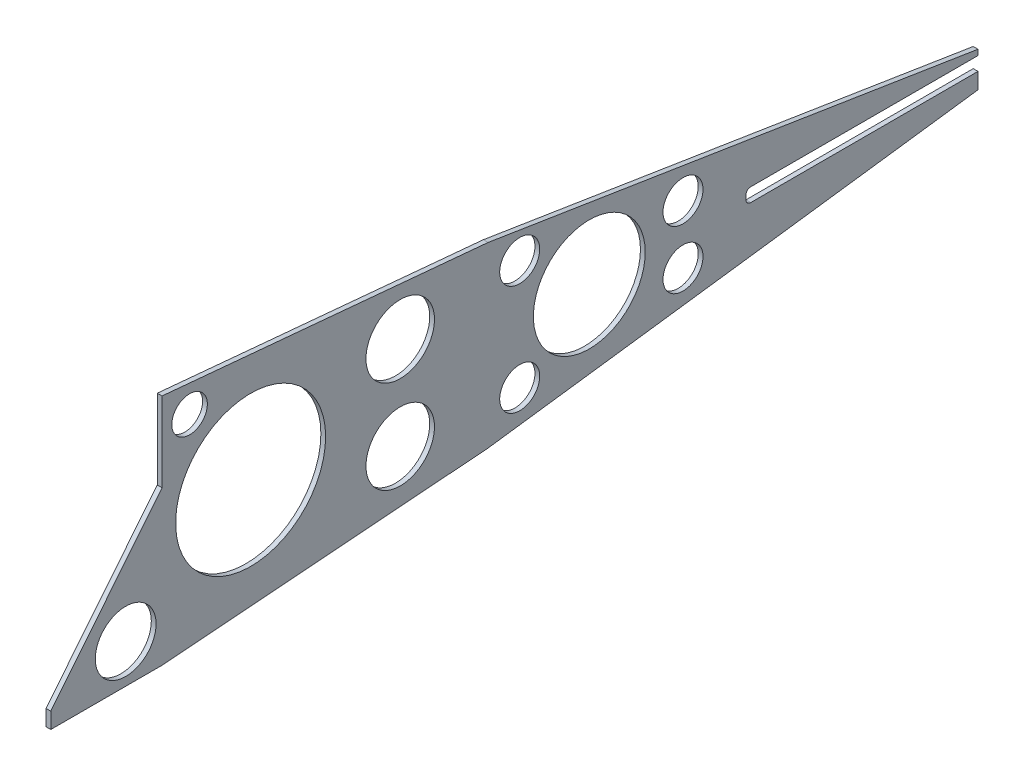
ISO-10303-21;
HEADER;
FILE_DESCRIPTION(('STEP AP214'),'2;1');
FILE_NAME('part.step','',(''),(''),'','','');
FILE_SCHEMA(('AUTOMOTIVE_DESIGN { 1 0 10303 214 1 1 1 1 }'));
ENDSEC;
DATA;
#1=APPLICATION_CONTEXT('core data for automotive mechanical design processes');
#2=APPLICATION_PROTOCOL_DEFINITION('international standard','automotive_design',2000,#1);
#3=PRODUCT_CONTEXT('',#1,'mechanical');
#4=PRODUCT('Part','Part','',(#3));
#5=PRODUCT_RELATED_PRODUCT_CATEGORY('part','',(#4));
#6=PRODUCT_DEFINITION_FORMATION('','',#4);
#7=PRODUCT_DEFINITION_CONTEXT('part definition',#1,'design');
#8=PRODUCT_DEFINITION('design','',#6,#7);
#9=PRODUCT_DEFINITION_SHAPE('','',#8);
#10=(LENGTH_UNIT() NAMED_UNIT(*) SI_UNIT(.MILLI.,.METRE.));
#11=(NAMED_UNIT(*) PLANE_ANGLE_UNIT() SI_UNIT($,.RADIAN.));
#12=(NAMED_UNIT(*) SI_UNIT($,.STERADIAN.) SOLID_ANGLE_UNIT());
#13=UNCERTAINTY_MEASURE_WITH_UNIT(LENGTH_MEASURE(1.E-05),#10,'distance_accuracy_value','');
#14=(GEOMETRIC_REPRESENTATION_CONTEXT(3) GLOBAL_UNCERTAINTY_ASSIGNED_CONTEXT((#13)) GLOBAL_UNIT_ASSIGNED_CONTEXT((#10,
#11,#12)) REPRESENTATION_CONTEXT('',''));
#15=CARTESIAN_POINT('',(0.,0.,0.));
#16=DIRECTION('',(0.,0.,1.));
#17=DIRECTION('',(1.,0.,0.));
#18=AXIS2_PLACEMENT_3D('',#15,#16,#17);
#19=CARTESIAN_POINT('',(-1.5,-0.530689138309698,-513.4));
#20=DIRECTION('',(0.,0.,-1.));
#21=DIRECTION('',(-1.,0.,0.));
#22=AXIS2_PLACEMENT_3D('',#19,#20,#21);
#23=PLANE('',#22);
#24=DIRECTION('',(-1.,0.,0.));
#25=VECTOR('',#24,1.);
#26=CARTESIAN_POINT('',(-1.5,-12.5999999999999,-513.4));
#27=LINE('',#26,#25);
#28=CARTESIAN_POINT('',(1.5,-12.5999999999999,-513.4));
#29=VERTEX_POINT('',#28);
#30=CARTESIAN_POINT('',(-1.5,-12.5999999999999,-513.4));
#31=VERTEX_POINT('',#30);
#32=EDGE_CURVE('E164',#29,#31,#27,.T.);
#33=ORIENTED_EDGE('',*,*,#32,.F.);
#34=DIRECTION('',(0.,1.,0.));
#35=VECTOR('',#34,1.);
#36=CARTESIAN_POINT('',(1.5,-0.530689138309698,-513.4));
#37=LINE('',#36,#35);
#38=CARTESIAN_POINT('',(1.5,-22.6501543513627,-513.4));
#39=VERTEX_POINT('',#38);
#40=EDGE_CURVE('E257',#39,#29,#37,.T.);
#41=ORIENTED_EDGE('',*,*,#40,.F.);
#42=DIRECTION('',(1.,0.,0.));
#43=VECTOR('',#42,1.);
#44=CARTESIAN_POINT('',(-1.5,-22.6501543513627,-513.4));
#45=LINE('',#44,#43);
#46=CARTESIAN_POINT('',(-1.5,-22.6501543513627,-513.4));
#47=VERTEX_POINT('',#46);
#48=EDGE_CURVE('E198',#47,#39,#45,.T.);
#49=ORIENTED_EDGE('',*,*,#48,.F.);
#50=DIRECTION('',(0.,1.,0.));
#51=VECTOR('',#50,1.);
#52=CARTESIAN_POINT('',(-1.5,-0.530689138309698,-513.4));
#53=LINE('',#52,#51);
#54=EDGE_CURVE('E172',#47,#31,#53,.T.);
#55=ORIENTED_EDGE('',*,*,#54,.T.);
#56=EDGE_LOOP('',(#33,#41,#49,#55));
#57=FACE_BOUND('',#56,.T.);
#58=ADVANCED_FACE('F39',(#57),#23,.T.);
#59=CARTESIAN_POINT('',(-1.5,17.2248503298606,0.));
#60=DIRECTION('',(0.,0.627918395010104,0.778279184616892));
#61=DIRECTION('',(0.,-0.778279184616892,0.627918395010104));
#62=AXIS2_PLACEMENT_3D('',#59,#60,#61);
#63=PLANE('',#62);
#64=DIRECTION('',(1.,0.,0.));
#65=VECTOR('',#64,1.);
#66=CARTESIAN_POINT('',(-1.5,-69.5372884386745,70.));
#67=LINE('',#66,#65);
#68=CARTESIAN_POINT('',(-1.5,-69.5372884386745,70.));
#69=VERTEX_POINT('',#68);
#70=CARTESIAN_POINT('',(1.5,-69.5372884386745,70.));
#71=VERTEX_POINT('',#70);
#72=EDGE_CURVE('E188',#69,#71,#67,.T.);
#73=ORIENTED_EDGE('',*,*,#72,.T.);
#74=DIRECTION('',(0.,-0.778279184616892,0.627918395010104));
#75=VECTOR('',#74,1.);
#76=CARTESIAN_POINT('',(1.5,17.2248503298606,0.));
#77=LINE('',#76,#75);
#78=CARTESIAN_POINT('',(1.5,17.2248503298606,0.));
#79=VERTEX_POINT('',#78);
#80=EDGE_CURVE('E242',#79,#71,#77,.T.);
#81=ORIENTED_EDGE('',*,*,#80,.F.);
#82=DIRECTION('',(1.,0.,0.));
#83=VECTOR('',#82,1.);
#84=CARTESIAN_POINT('',(-1.5,17.2248503298606,0.));
#85=LINE('',#84,#83);
#86=CARTESIAN_POINT('',(-1.5,17.2248503298606,0.));
#87=VERTEX_POINT('',#86);
#88=EDGE_CURVE('E189',#87,#79,#85,.T.);
#89=ORIENTED_EDGE('',*,*,#88,.F.);
#90=DIRECTION('',(0.,-0.778279184616892,0.627918395010104));
#91=VECTOR('',#90,1.);
#92=CARTESIAN_POINT('',(-1.5,17.2248503298606,0.));
#93=LINE('',#92,#91);
#94=EDGE_CURVE('E268',#87,#69,#93,.T.);
#95=ORIENTED_EDGE('',*,*,#94,.T.);
#96=EDGE_LOOP('',(#73,#81,#89,#95));
#97=FACE_BOUND('',#96,.T.);
#98=ADVANCED_FACE('F293',(#97),#63,.T.);
#99=CARTESIAN_POINT('',(-1.5,67.2248503298606,0.));
#100=DIRECTION('',(0.,0.,1.));
#101=DIRECTION('',(0.,-1.,0.));
#102=AXIS2_PLACEMENT_3D('',#99,#100,#101);
#103=PLANE('',#102);
#104=ORIENTED_EDGE('',*,*,#88,.T.);
#105=DIRECTION('',(0.,-1.,0.));
#106=VECTOR('',#105,1.);
#107=CARTESIAN_POINT('',(1.5,67.2248503298606,0.));
#108=LINE('',#107,#106);
#109=CARTESIAN_POINT('',(1.5,67.2248503298606,0.));
#110=VERTEX_POINT('',#109);
#111=EDGE_CURVE('E265',#110,#79,#108,.T.);
#112=ORIENTED_EDGE('',*,*,#111,.F.);
#113=DIRECTION('',(1.,0.,0.));
#114=VECTOR('',#113,1.);
#115=CARTESIAN_POINT('',(-1.5,67.2248503298606,0.));
#116=LINE('',#115,#114);
#117=CARTESIAN_POINT('',(-1.5,67.2248503298606,0.));
#118=VERTEX_POINT('',#117);
#119=EDGE_CURVE('E192',#118,#110,#116,.T.);
#120=ORIENTED_EDGE('',*,*,#119,.F.);
#121=DIRECTION('',(0.,-1.,0.));
#122=VECTOR('',#121,1.);
#123=CARTESIAN_POINT('',(-1.5,67.2248503298606,0.));
#124=LINE('',#123,#122);
#125=EDGE_CURVE('E185',#118,#87,#124,.T.);
#126=ORIENTED_EDGE('',*,*,#125,.T.);
#127=EDGE_LOOP('',(#104,#112,#120,#126));
#128=FACE_BOUND('',#127,.T.);
#129=ADVANCED_FACE('F297',(#128),#103,.T.);
#130=CARTESIAN_POINT('',(-1.5,67.2248503298606,0.));
#131=DIRECTION('',(0.,0.995767728619681,-0.0919055528224595));
#132=DIRECTION('',(0.,0.0919055528224595,0.995767728619681));
#133=AXIS2_PLACEMENT_3D('',#130,#131,#132);
#134=PLANE('',#133);
#135=ORIENTED_EDGE('',*,*,#119,.T.);
#136=DIRECTION('',(0.,0.0919055528224595,0.995767728619681));
#137=VECTOR('',#136,1.);
#138=CARTESIAN_POINT('',(1.5,67.2248503298606,0.));
#139=LINE('',#138,#137);
#140=CARTESIAN_POINT('',(1.5,48.288859026105,-205.165503831176));
#141=VERTEX_POINT('',#140);
#142=EDGE_CURVE('E262',#141,#110,#139,.T.);
#143=ORIENTED_EDGE('',*,*,#142,.F.);
#144=DIRECTION('',(1.,0.,0.));
#145=VECTOR('',#144,1.);
#146=CARTESIAN_POINT('',(-1.5,48.288859026105,-205.165503831176));
#147=LINE('',#146,#145);
#148=CARTESIAN_POINT('',(-1.5,48.288859026105,-205.165503831176));
#149=VERTEX_POINT('',#148);
#150=EDGE_CURVE('E194',#149,#141,#147,.T.);
#151=ORIENTED_EDGE('',*,*,#150,.F.);
#152=DIRECTION('',(0.,0.0919055528224595,0.995767728619681));
#153=VECTOR('',#152,1.);
#154=CARTESIAN_POINT('',(-1.5,67.2248503298606,0.));
#155=LINE('',#154,#153);
#156=EDGE_CURVE('E182',#149,#118,#155,.T.);
#157=ORIENTED_EDGE('',*,*,#156,.T.);
#158=EDGE_LOOP('',(#135,#143,#151,#157));
#159=FACE_BOUND('',#158,.T.);
#160=ADVANCED_FACE('F300',(#159),#134,.T.);
#161=CARTESIAN_POINT('',(-1.5,48.288859026105,-205.165503831176));
#162=DIRECTION('',(0.,0.987688340595138,-0.156434465040231));
#163=DIRECTION('',(0.,0.156434465040231,0.987688340595138));
#164=AXIS2_PLACEMENT_3D('',#161,#162,#163);
#165=PLANE('',#164);
#166=ORIENTED_EDGE('',*,*,#150,.T.);
#167=DIRECTION('',(0.,0.156434465040231,0.987688340595138));
#168=VECTOR('',#167,1.);
#169=CARTESIAN_POINT('',(1.5,48.288859026105,-205.165503831176));
#170=LINE('',#169,#168);
#171=CARTESIAN_POINT('',(1.5,-0.530689138309698,-513.4));
#172=VERTEX_POINT('',#171);
#173=EDGE_CURVE('E259',#172,#141,#170,.T.);
#174=ORIENTED_EDGE('',*,*,#173,.F.);
#175=DIRECTION('',(1.,0.,0.));
#176=VECTOR('',#175,1.);
#177=CARTESIAN_POINT('',(-1.5,-0.530689138309698,-513.4));
#178=LINE('',#177,#176);
#179=CARTESIAN_POINT('',(-1.5,-0.530689138309698,-513.4));
#180=VERTEX_POINT('',#179);
#181=EDGE_CURVE('E196',#180,#172,#178,.T.);
#182=ORIENTED_EDGE('',*,*,#181,.F.);
#183=DIRECTION('',(0.,0.156434465040231,0.987688340595138));
#184=VECTOR('',#183,1.);
#185=CARTESIAN_POINT('',(-1.5,48.288859026105,-205.165503831176));
#186=LINE('',#185,#184);
#187=EDGE_CURVE('E171',#180,#149,#186,.T.);
#188=ORIENTED_EDGE('',*,*,#187,.T.);
#189=EDGE_LOOP('',(#166,#174,#182,#188));
#190=FACE_BOUND('',#189,.T.);
#191=ADVANCED_FACE('F302',(#190),#165,.T.);
#192=DIRECTION('',(1.,0.,0.));
#193=VECTOR('',#192,1.);
#194=CARTESIAN_POINT('',(-1.5,-3.99999999999994,-513.4));
#195=LINE('',#194,#193);
#196=CARTESIAN_POINT('',(-1.5,-3.99999999999994,-513.4));
#197=VERTEX_POINT('',#196);
#198=CARTESIAN_POINT('',(1.5,-3.99999999999995,-513.4));
#199=VERTEX_POINT('',#198);
#200=EDGE_CURVE('E148',#197,#199,#195,.T.);
#201=ORIENTED_EDGE('',*,*,#200,.F.);
#202=EDGE_CURVE('E161',#197,#180,#53,.T.);
#203=ORIENTED_EDGE('',*,*,#202,.T.);
#204=ORIENTED_EDGE('',*,*,#181,.T.);
#205=EDGE_CURVE('E163',#199,#172,#37,.T.);
#206=ORIENTED_EDGE('',*,*,#205,.F.);
#207=EDGE_LOOP('',(#201,#203,#204,#206));
#208=FACE_BOUND('',#207,.T.);
#209=ADVANCED_FACE('F159',(#208),#23,.T.);
#210=CARTESIAN_POINT('',(-1.5,-22.6501543513627,-513.4));
#211=DIRECTION('',(0.,-0.991235972394931,-0.132103168131108));
#212=DIRECTION('',(0.,0.132103168131108,-0.991235972394931));
#213=AXIS2_PLACEMENT_3D('',#210,#211,#212);
#214=PLANE('',#213);
#215=ORIENTED_EDGE('',*,*,#48,.T.);
#216=DIRECTION('',(0.,0.132103168131108,-0.991235972394931));
#217=VECTOR('',#216,1.);
#218=CARTESIAN_POINT('',(1.5,-22.6501543513627,-513.4));
#219=LINE('',#218,#217);
#220=CARTESIAN_POINT('',(1.5,-63.7176077513932,-205.250409943522));
#221=VERTEX_POINT('',#220);
#222=EDGE_CURVE('E254',#221,#39,#219,.T.);
#223=ORIENTED_EDGE('',*,*,#222,.F.);
#224=DIRECTION('',(1.,0.,0.));
#225=VECTOR('',#224,1.);
#226=CARTESIAN_POINT('',(-1.5,-63.7176077513932,-205.250409943522));
#227=LINE('',#226,#225);
#228=CARTESIAN_POINT('',(-1.5,-63.7176077513932,-205.250409943522));
#229=VERTEX_POINT('',#228);
#230=EDGE_CURVE('E200',#229,#221,#227,.T.);
#231=ORIENTED_EDGE('',*,*,#230,.F.);
#232=DIRECTION('',(0.,0.132103168131108,-0.991235972394931));
#233=VECTOR('',#232,1.);
#234=CARTESIAN_POINT('',(-1.5,-22.6501543513627,-513.4));
#235=LINE('',#234,#233);
#236=EDGE_CURVE('E173',#229,#47,#235,.T.);
#237=ORIENTED_EDGE('',*,*,#236,.T.);
#238=EDGE_LOOP('',(#215,#223,#231,#237));
#239=FACE_BOUND('',#238,.T.);
#240=ADVANCED_FACE('F323',(#239),#214,.T.);
#241=CARTESIAN_POINT('',(-1.5,-63.7176077513932,-205.250409943522));
#242=DIRECTION('',(0.,-0.997042888850237,-0.0768471066024929));
#243=DIRECTION('',(0.,0.0768471066024929,-0.997042888850237));
#244=AXIS2_PLACEMENT_3D('',#241,#242,#243);
#245=PLANE('',#244);
#246=ORIENTED_EDGE('',*,*,#230,.T.);
#247=DIRECTION('',(0.,0.0768471066024929,-0.997042888850237));
#248=VECTOR('',#247,1.);
#249=CARTESIAN_POINT('',(1.5,-63.7176077513932,-205.250409943522));
#250=LINE('',#249,#248);
#251=CARTESIAN_POINT('',(1.5,-79.5372884386745,0.));
#252=VERTEX_POINT('',#251);
#253=EDGE_CURVE('E251',#252,#221,#250,.T.);
#254=ORIENTED_EDGE('',*,*,#253,.F.);
#255=DIRECTION('',(1.,0.,0.));
#256=VECTOR('',#255,1.);
#257=CARTESIAN_POINT('',(-1.5,-79.5372884386745,0.));
#258=LINE('',#257,#256);
#259=CARTESIAN_POINT('',(-1.5,-79.5372884386745,0.));
#260=VERTEX_POINT('',#259);
#261=EDGE_CURVE('E202',#260,#252,#258,.T.);
#262=ORIENTED_EDGE('',*,*,#261,.F.);
#263=DIRECTION('',(0.,0.0768471066024929,-0.997042888850237));
#264=VECTOR('',#263,1.);
#265=CARTESIAN_POINT('',(-1.5,-63.7176077513932,-205.250409943522));
#266=LINE('',#265,#264);
#267=EDGE_CURVE('E177',#260,#229,#266,.T.);
#268=ORIENTED_EDGE('',*,*,#267,.T.);
#269=EDGE_LOOP('',(#246,#254,#262,#268));
#270=FACE_BOUND('',#269,.T.);
#271=ADVANCED_FACE('F279',(#270),#245,.T.);
#272=CARTESIAN_POINT('',(-1.5,-79.5372884386745,70.));
#273=DIRECTION('',(0.,-1.,0.));
#274=DIRECTION('',(0.,0.,-1.));
#275=AXIS2_PLACEMENT_3D('',#272,#273,#274);
#276=PLANE('',#275);
#277=ORIENTED_EDGE('',*,*,#261,.T.);
#278=DIRECTION('',(0.,0.,-1.));
#279=VECTOR('',#278,1.);
#280=CARTESIAN_POINT('',(1.5,-79.5372884386745,70.));
#281=LINE('',#280,#279);
#282=CARTESIAN_POINT('',(1.5,-79.5372884386745,70.));
#283=VERTEX_POINT('',#282);
#284=EDGE_CURVE('E248',#283,#252,#281,.T.);
#285=ORIENTED_EDGE('',*,*,#284,.F.);
#286=DIRECTION('',(1.,0.,0.));
#287=VECTOR('',#286,1.);
#288=CARTESIAN_POINT('',(-1.5,-79.5372884386745,70.));
#289=LINE('',#288,#287);
#290=CARTESIAN_POINT('',(-1.5,-79.5372884386745,70.));
#291=VERTEX_POINT('',#290);
#292=EDGE_CURVE('E204',#291,#283,#289,.T.);
#293=ORIENTED_EDGE('',*,*,#292,.F.);
#294=DIRECTION('',(0.,0.,-1.));
#295=VECTOR('',#294,1.);
#296=CARTESIAN_POINT('',(-1.5,-79.5372884386745,70.));
#297=LINE('',#296,#295);
#298=EDGE_CURVE('E274',#291,#260,#297,.T.);
#299=ORIENTED_EDGE('',*,*,#298,.T.);
#300=EDGE_LOOP('',(#277,#285,#293,#299));
#301=FACE_BOUND('',#300,.T.);
#302=ADVANCED_FACE('F285',(#301),#276,.T.);
#303=CARTESIAN_POINT('',(-1.5,-69.5372884386745,70.));
#304=DIRECTION('',(0.,0.,1.));
#305=DIRECTION('',(1.,0.,0.));
#306=AXIS2_PLACEMENT_3D('',#303,#304,#305);
#307=PLANE('',#306);
#308=ORIENTED_EDGE('',*,*,#292,.T.);
#309=DIRECTION('',(0.,-1.,0.));
#310=VECTOR('',#309,1.);
#311=CARTESIAN_POINT('',(1.5,-69.5372884386745,70.));
#312=LINE('',#311,#310);
#313=EDGE_CURVE('E245',#71,#283,#312,.T.);
#314=ORIENTED_EDGE('',*,*,#313,.F.);
#315=ORIENTED_EDGE('',*,*,#72,.F.);
#316=DIRECTION('',(0.,-1.,0.));
#317=VECTOR('',#316,1.);
#318=CARTESIAN_POINT('',(-1.5,-69.5372884386745,70.));
#319=LINE('',#318,#317);
#320=EDGE_CURVE('E271',#69,#291,#319,.T.);
#321=ORIENTED_EDGE('',*,*,#320,.T.);
#322=EDGE_LOOP('',(#308,#314,#315,#321));
#323=FACE_BOUND('',#322,.T.);
#324=ADVANCED_FACE('F289',(#323),#307,.T.);
#325=CARTESIAN_POINT('',(-1.5,0.,0.));
#326=DIRECTION('',(1.,0.,0.));
#327=DIRECTION('',(0.,0.,-1.));
#328=AXIS2_PLACEMENT_3D('',#325,#326,#327);
#329=PLANE('',#328);
#330=CARTESIAN_POINT('',(-1.5,-55.0693391314664,22.8656003852971));
#331=DIRECTION('',(1.,0.,0.));
#332=DIRECTION('',(0.,0.,-1.));
#333=AXIS2_PLACEMENT_3D('',#330,#331,#332);
#334=CIRCLE('',#333,19.1193877962969);
#335=CARTESIAN_POINT('',(-1.5,-55.0693391314664,3.74621258900012));
#336=VERTEX_POINT('',#335);
#337=EDGE_CURVE('E230',#336,#336,#334,.T.);
#338=ORIENTED_EDGE('',*,*,#337,.T.);
#339=EDGE_LOOP('',(#338));
#340=FACE_BOUND('',#339,.T.);
#341=CARTESIAN_POINT('',(-1.5,9.70145914409179,-327.790100623759));
#342=DIRECTION('',(1.,0.,0.));
#343=DIRECTION('',(0.,0.,-1.));
#344=AXIS2_PLACEMENT_3D('',#341,#342,#343);
#345=CIRCLE('',#344,12.5869787378772);
#346=CARTESIAN_POINT('',(-1.5,9.70145914409179,-340.377079361636));
#347=VERTEX_POINT('',#346);
#348=EDGE_CURVE('E392',#347,#347,#345,.T.);
#349=ORIENTED_EDGE('',*,*,#348,.T.);
#350=EDGE_LOOP('',(#349));
#351=FACE_BOUND('',#350,.T.);
#352=CARTESIAN_POINT('',(-1.5,-35.1806808461792,-149.867646424436));
#353=DIRECTION('',(1.,0.,0.));
#354=DIRECTION('',(0.,0.,-1.));
#355=AXIS2_PLACEMENT_3D('',#352,#353,#354);
#356=CIRCLE('',#355,21.5573807133977);
#357=CARTESIAN_POINT('',(-1.5,-35.1806808461792,-171.425027137834));
#358=VERTEX_POINT('',#357);
#359=EDGE_CURVE('E395',#358,#358,#356,.T.);
#360=ORIENTED_EDGE('',*,*,#359,.T.);
#361=EDGE_LOOP('',(#360));
#362=FACE_BOUND('',#361,.T.);
#363=CARTESIAN_POINT('',(-1.5,23.2938907164738,-149.867646424436));
#364=DIRECTION('',(1.,0.,0.));
#365=DIRECTION('',(0.,0.,-1.));
#366=AXIS2_PLACEMENT_3D('',#363,#364,#365);
#367=CIRCLE('',#366,21.5573807133977);
#368=CARTESIAN_POINT('',(-1.5,23.2938907164738,-171.425027137834));
#369=VERTEX_POINT('',#368);
#370=EDGE_CURVE('E400',#369,#369,#367,.T.);
#371=ORIENTED_EDGE('',*,*,#370,.T.);
#372=EDGE_LOOP('',(#371));
#373=FACE_BOUND('',#372,.T.);
#374=CARTESIAN_POINT('',(-1.5,-6.37956663466746,-268.826339434975));
#375=DIRECTION('',(1.,0.,0.));
#376=DIRECTION('',(0.,0.,-1.));
#377=AXIS2_PLACEMENT_3D('',#374,#375,#376);
#378=CIRCLE('',#377,35.1869918395497);
#379=CARTESIAN_POINT('',(-1.5,-6.37956663466746,-304.013331274525));
#380=VERTEX_POINT('',#379);
#381=EDGE_CURVE('E403',#380,#380,#378,.T.);
#382=ORIENTED_EDGE('',*,*,#381,.T.);
#383=EDGE_LOOP('',(#382));
#384=FACE_BOUND('',#383,.T.);
#385=CARTESIAN_POINT('',(-1.5,-6.37956663466746,-55.7527478664149));
#386=DIRECTION('',(1.,0.,0.));
#387=DIRECTION('',(0.,0.,-1.));
#388=AXIS2_PLACEMENT_3D('',#385,#386,#387);
#389=CIRCLE('',#388,47.1913934733686);
#390=CARTESIAN_POINT('',(-1.5,-6.37956663466746,-102.944141339784));
#391=VERTEX_POINT('',#390);
#392=EDGE_CURVE('E406',#391,#391,#389,.T.);
#393=ORIENTED_EDGE('',*,*,#392,.T.);
#394=EDGE_LOOP('',(#393));
#395=FACE_BOUND('',#394,.T.);
#396=CARTESIAN_POINT('',(-1.5,28.4626558859776,-225.050213703908));
#397=DIRECTION('',(1.,0.,0.));
#398=DIRECTION('',(0.,0.,-1.));
#399=AXIS2_PLACEMENT_3D('',#396,#397,#398);
#400=CIRCLE('',#399,12.5869787378772);
#401=CARTESIAN_POINT('',(-1.5,28.4626558859776,-237.637192441785));
#402=VERTEX_POINT('',#401);
#403=EDGE_CURVE('E409',#402,#402,#400,.T.);
#404=ORIENTED_EDGE('',*,*,#403,.T.);
#405=EDGE_LOOP('',(#404));
#406=FACE_BOUND('',#405,.T.);
#407=CARTESIAN_POINT('',(-1.5,48.5639381094267,-17.3369640616011));
#408=DIRECTION('',(1.,0.,0.));
#409=DIRECTION('',(0.,0.,-1.));
#410=AXIS2_PLACEMENT_3D('',#407,#408,#409);
#411=CIRCLE('',#410,11.1896033535979);
#412=CARTESIAN_POINT('',(-1.5,48.5639381094267,-28.526567415199));
#413=VERTEX_POINT('',#412);
#414=EDGE_CURVE('E412',#413,#413,#411,.T.);
#415=ORIENTED_EDGE('',*,*,#414,.T.);
#416=EDGE_LOOP('',(#415));
#417=FACE_BOUND('',#416,.T.);
#418=CARTESIAN_POINT('',(-1.5,-40.7750939947914,-225.050213703908));
#419=DIRECTION('',(1.,0.,0.));
#420=DIRECTION('',(0.,0.,-1.));
#421=AXIS2_PLACEMENT_3D('',#418,#419,#420);
#422=CIRCLE('',#421,12.5869787378772);
#423=CARTESIAN_POINT('',(-1.5,-40.7750939947914,-237.637192441785));
#424=VERTEX_POINT('',#423);
#425=EDGE_CURVE('E415',#424,#424,#422,.T.);
#426=ORIENTED_EDGE('',*,*,#425,.T.);
#427=EDGE_LOOP('',(#426));
#428=FACE_BOUND('',#427,.T.);
#429=CARTESIAN_POINT('',(-1.5,-26.9275440186377,-327.790100623759));
#430=DIRECTION('',(1.,0.,0.));
#431=DIRECTION('',(0.,0.,-1.));
#432=AXIS2_PLACEMENT_3D('',#429,#430,#431);
#433=CIRCLE('',#432,12.5869787378772);
#434=CARTESIAN_POINT('',(-1.5,-26.9275440186377,-340.377079361636));
#435=VERTEX_POINT('',#434);
#436=EDGE_CURVE('E418',#435,#435,#433,.T.);
#437=ORIENTED_EDGE('',*,*,#436,.T.);
#438=EDGE_LOOP('',(#437));
#439=FACE_BOUND('',#438,.T.);
#440=DIRECTION('',(0.,0.,1.));
#441=VECTOR('',#440,1.);
#442=CARTESIAN_POINT('',(-1.5,-3.99999999999994,-519.4));
#443=LINE('',#442,#441);
#444=CARTESIAN_POINT('',(-1.5,-3.99999999999996,-370.4));
#445=VERTEX_POINT('',#444);
#446=EDGE_CURVE('E144',#197,#445,#443,.T.);
#447=ORIENTED_EDGE('',*,*,#446,.T.);
#448=CARTESIAN_POINT('',(-1.5,-6.99999999999995,-370.4));
#449=DIRECTION('',(1.,0.,0.));
#450=DIRECTION('',(0.,0.,-1.));
#451=AXIS2_PLACEMENT_3D('',#448,#449,#450);
#452=CIRCLE('',#451,3.);
#453=CARTESIAN_POINT('',(-1.5,-6.99999999999995,-367.4));
#454=VERTEX_POINT('',#453);
#455=EDGE_CURVE('E218',#445,#454,#452,.T.);
#456=ORIENTED_EDGE('',*,*,#455,.T.);
#457=DIRECTION('',(0.,-1.,0.));
#458=VECTOR('',#457,1.);
#459=CARTESIAN_POINT('',(-1.5,-3.99999999999996,-367.4));
#460=LINE('',#459,#458);
#461=CARTESIAN_POINT('',(-1.5,-9.59999999999995,-367.4));
#462=VERTEX_POINT('',#461);
#463=EDGE_CURVE('E154',#454,#462,#460,.T.);
#464=ORIENTED_EDGE('',*,*,#463,.T.);
#465=CARTESIAN_POINT('',(-1.5,-9.59999999999996,-370.4));
#466=DIRECTION('',(1.,0.,0.));
#467=DIRECTION('',(0.,0.,-1.));
#468=AXIS2_PLACEMENT_3D('',#465,#466,#467);
#469=CIRCLE('',#468,3.);
#470=CARTESIAN_POINT('',(-1.5,-12.6,-370.4));
#471=VERTEX_POINT('',#470);
#472=EDGE_CURVE('E11',#462,#471,#469,.T.);
#473=ORIENTED_EDGE('',*,*,#472,.T.);
#474=DIRECTION('',(0.,0.,-1.));
#475=VECTOR('',#474,1.);
#476=CARTESIAN_POINT('',(-1.5,-12.5999999999999,-519.4));
#477=LINE('',#476,#475);
#478=EDGE_CURVE('E165',#471,#31,#477,.T.);
#479=ORIENTED_EDGE('',*,*,#478,.T.);
#480=ORIENTED_EDGE('',*,*,#54,.F.);
#481=ORIENTED_EDGE('',*,*,#236,.F.);
#482=ORIENTED_EDGE('',*,*,#267,.F.);
#483=ORIENTED_EDGE('',*,*,#298,.F.);
#484=ORIENTED_EDGE('',*,*,#320,.F.);
#485=ORIENTED_EDGE('',*,*,#94,.F.);
#486=ORIENTED_EDGE('',*,*,#125,.F.);
#487=ORIENTED_EDGE('',*,*,#156,.F.);
#488=ORIENTED_EDGE('',*,*,#187,.F.);
#489=ORIENTED_EDGE('',*,*,#202,.F.);
#490=EDGE_LOOP('',(#447,#456,#464,#473,#479,#480,#481,#482,#483,#484,#485,#486,#487,#488,#489));
#491=FACE_BOUND('',#490,.T.);
#492=ADVANCED_FACE('F168',(#340,#351,#362,#373,#384,#395,#406,#417,#428,#439,#491),#329,.F.);
#493=CARTESIAN_POINT('',(1.5,0.,0.));
#494=DIRECTION('',(1.,0.,0.));
#495=DIRECTION('',(0.,0.,-1.));
#496=AXIS2_PLACEMENT_3D('',#493,#494,#495);
#497=PLANE('',#496);
#498=CARTESIAN_POINT('',(1.5,-55.0693391314664,22.8656003852971));
#499=DIRECTION('',(1.,0.,0.));
#500=DIRECTION('',(0.,0.,-1.));
#501=AXIS2_PLACEMENT_3D('',#498,#499,#500);
#502=CIRCLE('',#501,19.1193877962969);
#503=CARTESIAN_POINT('',(1.5,-55.0693391314664,3.74621258900012));
#504=VERTEX_POINT('',#503);
#505=EDGE_CURVE('E389',#504,#504,#502,.T.);
#506=ORIENTED_EDGE('',*,*,#505,.F.);
#507=EDGE_LOOP('',(#506));
#508=FACE_BOUND('',#507,.T.);
#509=CARTESIAN_POINT('',(1.5,9.70145914409179,-327.790100623759));
#510=DIRECTION('',(1.,0.,0.));
#511=DIRECTION('',(0.,0.,-1.));
#512=AXIS2_PLACEMENT_3D('',#509,#510,#511);
#513=CIRCLE('',#512,12.5869787378772);
#514=CARTESIAN_POINT('',(1.5,9.70145914409179,-340.377079361636));
#515=VERTEX_POINT('',#514);
#516=EDGE_CURVE('E438',#515,#515,#513,.T.);
#517=ORIENTED_EDGE('',*,*,#516,.F.);
#518=EDGE_LOOP('',(#517));
#519=FACE_BOUND('',#518,.T.);
#520=CARTESIAN_POINT('',(1.5,-35.1806808461792,-149.867646424436));
#521=DIRECTION('',(1.,0.,0.));
#522=DIRECTION('',(0.,0.,-1.));
#523=AXIS2_PLACEMENT_3D('',#520,#521,#522);
#524=CIRCLE('',#523,21.5573807133977);
#525=CARTESIAN_POINT('',(1.5,-35.1806808461792,-171.425027137834));
#526=VERTEX_POINT('',#525);
#527=EDGE_CURVE('E428',#526,#526,#524,.T.);
#528=ORIENTED_EDGE('',*,*,#527,.F.);
#529=EDGE_LOOP('',(#528));
#530=FACE_BOUND('',#529,.T.);
#531=CARTESIAN_POINT('',(1.5,23.2938907164738,-149.867646424436));
#532=DIRECTION('',(1.,0.,0.));
#533=DIRECTION('',(0.,0.,-1.));
#534=AXIS2_PLACEMENT_3D('',#531,#532,#533);
#535=CIRCLE('',#534,21.5573807133977);
#536=CARTESIAN_POINT('',(1.5,23.2938907164738,-171.425027137834));
#537=VERTEX_POINT('',#536);
#538=EDGE_CURVE('E425',#537,#537,#535,.T.);
#539=ORIENTED_EDGE('',*,*,#538,.F.);
#540=EDGE_LOOP('',(#539));
#541=FACE_BOUND('',#540,.T.);
#542=CARTESIAN_POINT('',(1.5,-6.37956663466746,-268.826339434975));
#543=DIRECTION('',(1.,0.,0.));
#544=DIRECTION('',(0.,0.,-1.));
#545=AXIS2_PLACEMENT_3D('',#542,#543,#544);
#546=CIRCLE('',#545,35.1869918395497);
#547=CARTESIAN_POINT('',(1.5,-6.37956663466746,-304.013331274525));
#548=VERTEX_POINT('',#547);
#549=EDGE_CURVE('E421',#548,#548,#546,.T.);
#550=ORIENTED_EDGE('',*,*,#549,.F.);
#551=EDGE_LOOP('',(#550));
#552=FACE_BOUND('',#551,.T.);
#553=CARTESIAN_POINT('',(1.5,-6.37956663466746,-55.7527478664149));
#554=DIRECTION('',(1.,0.,0.));
#555=DIRECTION('',(0.,0.,-1.));
#556=AXIS2_PLACEMENT_3D('',#553,#554,#555);
#557=CIRCLE('',#556,47.1913934733686);
#558=CARTESIAN_POINT('',(1.5,-6.37956663466746,-102.944141339784));
#559=VERTEX_POINT('',#558);
#560=EDGE_CURVE('E424',#559,#559,#557,.T.);
#561=ORIENTED_EDGE('',*,*,#560,.F.);
#562=EDGE_LOOP('',(#561));
#563=FACE_BOUND('',#562,.T.);
#564=CARTESIAN_POINT('',(1.5,28.4626558859776,-225.050213703908));
#565=DIRECTION('',(1.,0.,0.));
#566=DIRECTION('',(0.,0.,-1.));
#567=AXIS2_PLACEMENT_3D('',#564,#565,#566);
#568=CIRCLE('',#567,12.5869787378772);
#569=CARTESIAN_POINT('',(1.5,28.4626558859776,-237.637192441785));
#570=VERTEX_POINT('',#569);
#571=EDGE_CURVE('E431',#570,#570,#568,.T.);
#572=ORIENTED_EDGE('',*,*,#571,.F.);
#573=EDGE_LOOP('',(#572));
#574=FACE_BOUND('',#573,.T.);
#575=CARTESIAN_POINT('',(1.5,48.5639381094267,-17.3369640616011));
#576=DIRECTION('',(1.,0.,0.));
#577=DIRECTION('',(0.,0.,-1.));
#578=AXIS2_PLACEMENT_3D('',#575,#576,#577);
#579=CIRCLE('',#578,11.1896033535979);
#580=CARTESIAN_POINT('',(1.5,48.5639381094267,-28.526567415199));
#581=VERTEX_POINT('',#580);
#582=EDGE_CURVE('E441',#581,#581,#579,.T.);
#583=ORIENTED_EDGE('',*,*,#582,.F.);
#584=EDGE_LOOP('',(#583));
#585=FACE_BOUND('',#584,.T.);
#586=CARTESIAN_POINT('',(1.5,-40.7750939947914,-225.050213703908));
#587=DIRECTION('',(1.,0.,0.));
#588=DIRECTION('',(0.,0.,-1.));
#589=AXIS2_PLACEMENT_3D('',#586,#587,#588);
#590=CIRCLE('',#589,12.5869787378772);
#591=CARTESIAN_POINT('',(1.5,-40.7750939947914,-237.637192441785));
#592=VERTEX_POINT('',#591);
#593=EDGE_CURVE('E437',#592,#592,#590,.T.);
#594=ORIENTED_EDGE('',*,*,#593,.F.);
#595=EDGE_LOOP('',(#594));
#596=FACE_BOUND('',#595,.T.);
#597=CARTESIAN_POINT('',(1.5,-26.9275440186377,-327.790100623759));
#598=DIRECTION('',(1.,0.,0.));
#599=DIRECTION('',(0.,0.,-1.));
#600=AXIS2_PLACEMENT_3D('',#597,#598,#599);
#601=CIRCLE('',#600,12.5869787378772);
#602=CARTESIAN_POINT('',(1.5,-26.9275440186377,-340.377079361636));
#603=VERTEX_POINT('',#602);
#604=EDGE_CURVE('E434',#603,#603,#601,.T.);
#605=ORIENTED_EDGE('',*,*,#604,.F.);
#606=EDGE_LOOP('',(#605));
#607=FACE_BOUND('',#606,.T.);
#608=DIRECTION('',(0.,0.,-1.));
#609=VECTOR('',#608,1.);
#610=CARTESIAN_POINT('',(1.5,-12.5999999999999,-519.4));
#611=LINE('',#610,#609);
#612=CARTESIAN_POINT('',(1.5,-12.6,-370.4));
#613=VERTEX_POINT('',#612);
#614=EDGE_CURVE('E155',#613,#29,#611,.T.);
#615=ORIENTED_EDGE('',*,*,#614,.F.);
#616=CARTESIAN_POINT('',(1.5,-9.59999999999996,-370.4));
#617=DIRECTION('',(1.,0.,0.));
#618=DIRECTION('',(0.,0.,-1.));
#619=AXIS2_PLACEMENT_3D('',#616,#617,#618);
#620=CIRCLE('',#619,3.);
#621=CARTESIAN_POINT('',(1.5,-9.59999999999995,-367.4));
#622=VERTEX_POINT('',#621);
#623=EDGE_CURVE('E47',#613,#622,#620,.F.);
#624=ORIENTED_EDGE('',*,*,#623,.T.);
#625=DIRECTION('',(0.,-1.,0.));
#626=VECTOR('',#625,1.);
#627=CARTESIAN_POINT('',(1.5,-3.99999999999996,-367.4));
#628=LINE('',#627,#626);
#629=CARTESIAN_POINT('',(1.5,-6.99999999999995,-367.4));
#630=VERTEX_POINT('',#629);
#631=EDGE_CURVE('E224',#630,#622,#628,.T.);
#632=ORIENTED_EDGE('',*,*,#631,.F.);
#633=CARTESIAN_POINT('',(1.5,-6.99999999999995,-370.4));
#634=DIRECTION('',(1.,0.,0.));
#635=DIRECTION('',(0.,0.,-1.));
#636=AXIS2_PLACEMENT_3D('',#633,#634,#635);
#637=CIRCLE('',#636,3.);
#638=CARTESIAN_POINT('',(1.5,-3.99999999999995,-370.4));
#639=VERTEX_POINT('',#638);
#640=EDGE_CURVE('E216',#630,#639,#637,.F.);
#641=ORIENTED_EDGE('',*,*,#640,.T.);
#642=DIRECTION('',(0.,0.,1.));
#643=VECTOR('',#642,1.);
#644=CARTESIAN_POINT('',(1.5,-4.,0.));
#645=LINE('',#644,#643);
#646=EDGE_CURVE('E191',#199,#639,#645,.T.);
#647=ORIENTED_EDGE('',*,*,#646,.F.);
#648=ORIENTED_EDGE('',*,*,#205,.T.);
#649=ORIENTED_EDGE('',*,*,#173,.T.);
#650=ORIENTED_EDGE('',*,*,#142,.T.);
#651=ORIENTED_EDGE('',*,*,#111,.T.);
#652=ORIENTED_EDGE('',*,*,#80,.T.);
#653=ORIENTED_EDGE('',*,*,#313,.T.);
#654=ORIENTED_EDGE('',*,*,#284,.T.);
#655=ORIENTED_EDGE('',*,*,#253,.T.);
#656=ORIENTED_EDGE('',*,*,#222,.T.);
#657=ORIENTED_EDGE('',*,*,#40,.T.);
#658=EDGE_LOOP('',(#615,#624,#632,#641,#647,#648,#649,#650,#651,#652,#653,#654,#655,#656,#657));
#659=FACE_BOUND('',#658,.T.);
#660=ADVANCED_FACE('F223',(#508,#519,#530,#541,#552,#563,#574,#585,#596,#607,#659),#497,.T.);
#661=CARTESIAN_POINT('',(-1.5,-12.5999999999999,-519.4));
#662=DIRECTION('',(0.,-1.,0.));
#663=DIRECTION('',(0.,0.,-1.));
#664=AXIS2_PLACEMENT_3D('',#661,#662,#663);
#665=PLANE('',#664);
#666=ORIENTED_EDGE('',*,*,#478,.F.);
#667=DIRECTION('',(1.,0.,0.));
#668=VECTOR('',#667,1.);
#669=CARTESIAN_POINT('',(1.5,-12.6,-370.4));
#670=LINE('',#669,#668);
#671=EDGE_CURVE('E214',#471,#613,#670,.T.);
#672=ORIENTED_EDGE('',*,*,#671,.T.);
#673=ORIENTED_EDGE('',*,*,#614,.T.);
#674=ORIENTED_EDGE('',*,*,#32,.T.);
#675=EDGE_LOOP('',(#666,#672,#673,#674));
#676=FACE_BOUND('',#675,.T.);
#677=ADVANCED_FACE('F233',(#676),#665,.F.);
#678=CARTESIAN_POINT('',(-1.5,-3.99999999999996,-367.4));
#679=DIRECTION('',(0.,0.,1.));
#680=DIRECTION('',(1.,0.,0.));
#681=AXIS2_PLACEMENT_3D('',#678,#679,#680);
#682=PLANE('',#681);
#683=ORIENTED_EDGE('',*,*,#463,.F.);
#684=DIRECTION('',(1.,0.,0.));
#685=VECTOR('',#684,1.);
#686=CARTESIAN_POINT('',(1.5,-6.99999999999995,-367.4));
#687=LINE('',#686,#685);
#688=EDGE_CURVE('E210',#454,#630,#687,.T.);
#689=ORIENTED_EDGE('',*,*,#688,.T.);
#690=ORIENTED_EDGE('',*,*,#631,.T.);
#691=DIRECTION('',(1.,0.,0.));
#692=VECTOR('',#691,1.);
#693=CARTESIAN_POINT('',(-1.5,-9.59999999999996,-367.4));
#694=LINE('',#693,#692);
#695=EDGE_CURVE('E208',#622,#462,#694,.F.);
#696=ORIENTED_EDGE('',*,*,#695,.T.);
#697=EDGE_LOOP('',(#683,#689,#690,#696));
#698=FACE_BOUND('',#697,.T.);
#699=ADVANCED_FACE('F228',(#698),#682,.F.);
#700=CARTESIAN_POINT('',(-1.5,-3.99999999999994,-519.4));
#701=DIRECTION('',(0.,1.,0.));
#702=DIRECTION('',(0.,0.,1.));
#703=AXIS2_PLACEMENT_3D('',#700,#701,#702);
#704=PLANE('',#703);
#705=ORIENTED_EDGE('',*,*,#646,.T.);
#706=DIRECTION('',(1.,0.,0.));
#707=VECTOR('',#706,1.);
#708=CARTESIAN_POINT('',(-1.5,-3.99999999999996,-370.4));
#709=LINE('',#708,#707);
#710=EDGE_CURVE('E151',#639,#445,#709,.F.);
#711=ORIENTED_EDGE('',*,*,#710,.T.);
#712=ORIENTED_EDGE('',*,*,#446,.F.);
#713=ORIENTED_EDGE('',*,*,#200,.T.);
#714=EDGE_LOOP('',(#705,#711,#712,#713));
#715=FACE_BOUND('',#714,.T.);
#716=ADVANCED_FACE('F147',(#715),#704,.F.);
#717=CARTESIAN_POINT('',(-1.5,-6.99999999999995,-370.4));
#718=DIRECTION('',(-1.,0.,0.));
#719=DIRECTION('',(0.,0.,1.));
#720=AXIS2_PLACEMENT_3D('',#717,#718,#719);
#721=CYLINDRICAL_SURFACE('',#720,3.);
#722=ORIENTED_EDGE('',*,*,#455,.F.);
#723=ORIENTED_EDGE('',*,*,#710,.F.);
#724=ORIENTED_EDGE('',*,*,#640,.F.);
#725=ORIENTED_EDGE('',*,*,#688,.F.);
#726=EDGE_LOOP('',(#722,#723,#724,#725));
#727=FACE_BOUND('',#726,.T.);
#728=ADVANCED_FACE('F305',(#727),#721,.F.);
#729=CARTESIAN_POINT('',(-1.5,-9.59999999999996,-370.4));
#730=DIRECTION('',(-1.,0.,0.));
#731=DIRECTION('',(0.,0.,1.));
#732=AXIS2_PLACEMENT_3D('',#729,#730,#731);
#733=CYLINDRICAL_SURFACE('',#732,3.);
#734=ORIENTED_EDGE('',*,*,#472,.F.);
#735=ORIENTED_EDGE('',*,*,#695,.F.);
#736=ORIENTED_EDGE('',*,*,#623,.F.);
#737=ORIENTED_EDGE('',*,*,#671,.F.);
#738=EDGE_LOOP('',(#734,#735,#736,#737));
#739=FACE_BOUND('',#738,.T.);
#740=ADVANCED_FACE('F41',(#739),#733,.F.);
#741=CARTESIAN_POINT('',(-8.5,-26.9275440186377,-327.790100623759));
#742=DIRECTION('',(1.,0.,0.));
#743=DIRECTION('',(0.,0.,-1.));
#744=AXIS2_PLACEMENT_3D('',#741,#742,#743);
#745=CYLINDRICAL_SURFACE('',#744,12.5869787378772);
#746=ORIENTED_EDGE('',*,*,#604,.T.);
#747=EDGE_LOOP('',(#746));
#748=FACE_BOUND('',#747,.T.);
#749=ORIENTED_EDGE('',*,*,#436,.F.);
#750=EDGE_LOOP('',(#749));
#751=FACE_BOUND('',#750,.T.);
#752=ADVANCED_FACE('F311',(#748,#751),#745,.F.);
#753=CARTESIAN_POINT('',(-8.5,-40.7750939947914,-225.050213703908));
#754=DIRECTION('',(1.,0.,0.));
#755=DIRECTION('',(0.,0.,-1.));
#756=AXIS2_PLACEMENT_3D('',#753,#754,#755);
#757=CYLINDRICAL_SURFACE('',#756,12.5869787378772);
#758=ORIENTED_EDGE('',*,*,#593,.T.);
#759=EDGE_LOOP('',(#758));
#760=FACE_BOUND('',#759,.T.);
#761=ORIENTED_EDGE('',*,*,#425,.F.);
#762=EDGE_LOOP('',(#761));
#763=FACE_BOUND('',#762,.T.);
#764=ADVANCED_FACE('F366',(#760,#763),#757,.F.);
#765=CARTESIAN_POINT('',(-8.5,48.5639381094267,-17.3369640616011));
#766=DIRECTION('',(1.,0.,0.));
#767=DIRECTION('',(0.,0.,-1.));
#768=AXIS2_PLACEMENT_3D('',#765,#766,#767);
#769=CYLINDRICAL_SURFACE('',#768,11.1896033535979);
#770=ORIENTED_EDGE('',*,*,#582,.T.);
#771=EDGE_LOOP('',(#770));
#772=FACE_BOUND('',#771,.T.);
#773=ORIENTED_EDGE('',*,*,#414,.F.);
#774=EDGE_LOOP('',(#773));
#775=FACE_BOUND('',#774,.T.);
#776=ADVANCED_FACE('F370',(#772,#775),#769,.F.);
#777=CARTESIAN_POINT('',(-8.5,28.4626558859776,-225.050213703908));
#778=DIRECTION('',(1.,0.,0.));
#779=DIRECTION('',(0.,0.,-1.));
#780=AXIS2_PLACEMENT_3D('',#777,#778,#779);
#781=CYLINDRICAL_SURFACE('',#780,12.5869787378772);
#782=ORIENTED_EDGE('',*,*,#571,.T.);
#783=EDGE_LOOP('',(#782));
#784=FACE_BOUND('',#783,.T.);
#785=ORIENTED_EDGE('',*,*,#403,.F.);
#786=EDGE_LOOP('',(#785));
#787=FACE_BOUND('',#786,.T.);
#788=ADVANCED_FACE('F354',(#784,#787),#781,.F.);
#789=CARTESIAN_POINT('',(-8.5,-6.37956663466746,-55.7527478664149));
#790=DIRECTION('',(1.,0.,0.));
#791=DIRECTION('',(0.,0.,-1.));
#792=AXIS2_PLACEMENT_3D('',#789,#790,#791);
#793=CYLINDRICAL_SURFACE('',#792,47.1913934733686);
#794=ORIENTED_EDGE('',*,*,#560,.T.);
#795=EDGE_LOOP('',(#794));
#796=FACE_BOUND('',#795,.T.);
#797=ORIENTED_EDGE('',*,*,#392,.F.);
#798=EDGE_LOOP('',(#797));
#799=FACE_BOUND('',#798,.T.);
#800=ADVANCED_FACE('F350',(#796,#799),#793,.F.);
#801=CARTESIAN_POINT('',(-8.5,-6.37956663466746,-268.826339434975));
#802=DIRECTION('',(1.,0.,0.));
#803=DIRECTION('',(0.,0.,-1.));
#804=AXIS2_PLACEMENT_3D('',#801,#802,#803);
#805=CYLINDRICAL_SURFACE('',#804,35.1869918395497);
#806=ORIENTED_EDGE('',*,*,#549,.T.);
#807=EDGE_LOOP('',(#806));
#808=FACE_BOUND('',#807,.T.);
#809=ORIENTED_EDGE('',*,*,#381,.F.);
#810=EDGE_LOOP('',(#809));
#811=FACE_BOUND('',#810,.T.);
#812=ADVANCED_FACE('F346',(#808,#811),#805,.F.);
#813=CARTESIAN_POINT('',(-8.5,23.2938907164738,-149.867646424436));
#814=DIRECTION('',(1.,0.,0.));
#815=DIRECTION('',(0.,0.,-1.));
#816=AXIS2_PLACEMENT_3D('',#813,#814,#815);
#817=CYLINDRICAL_SURFACE('',#816,21.5573807133977);
#818=ORIENTED_EDGE('',*,*,#538,.T.);
#819=EDGE_LOOP('',(#818));
#820=FACE_BOUND('',#819,.T.);
#821=ORIENTED_EDGE('',*,*,#370,.F.);
#822=EDGE_LOOP('',(#821));
#823=FACE_BOUND('',#822,.T.);
#824=ADVANCED_FACE('F349',(#820,#823),#817,.F.);
#825=CARTESIAN_POINT('',(-8.5,-35.1806808461792,-149.867646424436));
#826=DIRECTION('',(1.,0.,0.));
#827=DIRECTION('',(0.,0.,-1.));
#828=AXIS2_PLACEMENT_3D('',#825,#826,#827);
#829=CYLINDRICAL_SURFACE('',#828,21.5573807133977);
#830=ORIENTED_EDGE('',*,*,#527,.T.);
#831=EDGE_LOOP('',(#830));
#832=FACE_BOUND('',#831,.T.);
#833=ORIENTED_EDGE('',*,*,#359,.F.);
#834=EDGE_LOOP('',(#833));
#835=FACE_BOUND('',#834,.T.);
#836=ADVANCED_FACE('F356',(#832,#835),#829,.F.);
#837=CARTESIAN_POINT('',(-8.5,9.70145914409179,-327.790100623759));
#838=DIRECTION('',(1.,0.,0.));
#839=DIRECTION('',(0.,0.,-1.));
#840=AXIS2_PLACEMENT_3D('',#837,#838,#839);
#841=CYLINDRICAL_SURFACE('',#840,12.5869787378772);
#842=ORIENTED_EDGE('',*,*,#516,.T.);
#843=EDGE_LOOP('',(#842));
#844=FACE_BOUND('',#843,.T.);
#845=ORIENTED_EDGE('',*,*,#348,.F.);
#846=EDGE_LOOP('',(#845));
#847=FACE_BOUND('',#846,.T.);
#848=ADVANCED_FACE('F359',(#844,#847),#841,.F.);
#849=CARTESIAN_POINT('',(-8.5,-55.0693391314664,22.8656003852971));
#850=DIRECTION('',(1.,0.,0.));
#851=DIRECTION('',(0.,0.,-1.));
#852=AXIS2_PLACEMENT_3D('',#849,#850,#851);
#853=CYLINDRICAL_SURFACE('',#852,19.1193877962969);
#854=ORIENTED_EDGE('',*,*,#505,.T.);
#855=EDGE_LOOP('',(#854));
#856=FACE_BOUND('',#855,.T.);
#857=ORIENTED_EDGE('',*,*,#337,.F.);
#858=EDGE_LOOP('',(#857));
#859=FACE_BOUND('',#858,.T.);
#860=ADVANCED_FACE('F380',(#856,#859),#853,.F.);
#861=CLOSED_SHELL('',(#58,#98,#129,#160,#191,#209,#240,#271,#302,#324,#492,#660,#677,#699,#716,
#728,#740,#752,#764,#776,#788,#800,#812,#824,#836,#848,#860));
#862=MANIFOLD_SOLID_BREP('B2',#861);
#863=ADVANCED_BREP_SHAPE_REPRESENTATION('',(#18,#862),#14);
#864=SHAPE_DEFINITION_REPRESENTATION(#9,#863);
ENDSEC;
END-ISO-10303-21;
